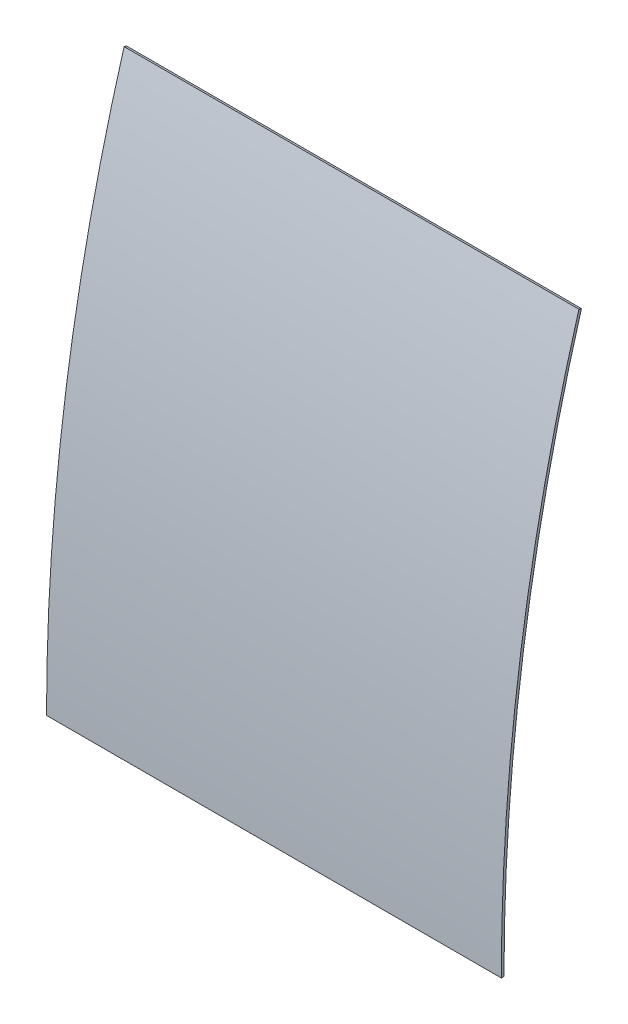
ISO-10303-21;
HEADER;
FILE_DESCRIPTION(('STEP AP214'),'2;1');
FILE_NAME('part.step','',(''),(''),'','','');
FILE_SCHEMA(('AUTOMOTIVE_DESIGN { 1 0 10303 214 1 1 1 1 }'));
ENDSEC;
DATA;
#1=APPLICATION_CONTEXT('core data for automotive mechanical design processes');
#2=APPLICATION_PROTOCOL_DEFINITION('international standard','automotive_design',2000,#1);
#3=PRODUCT_CONTEXT('',#1,'mechanical');
#4=PRODUCT('Part','Part','',(#3));
#5=PRODUCT_RELATED_PRODUCT_CATEGORY('part','',(#4));
#6=PRODUCT_DEFINITION_FORMATION('','',#4);
#7=PRODUCT_DEFINITION_CONTEXT('part definition',#1,'design');
#8=PRODUCT_DEFINITION('design','',#6,#7);
#9=PRODUCT_DEFINITION_SHAPE('','',#8);
#10=(LENGTH_UNIT() NAMED_UNIT(*) SI_UNIT(.MILLI.,.METRE.));
#11=(NAMED_UNIT(*) PLANE_ANGLE_UNIT() SI_UNIT($,.RADIAN.));
#12=(NAMED_UNIT(*) SI_UNIT($,.STERADIAN.) SOLID_ANGLE_UNIT());
#13=UNCERTAINTY_MEASURE_WITH_UNIT(LENGTH_MEASURE(1.E-05),#10,'distance_accuracy_value','');
#14=(GEOMETRIC_REPRESENTATION_CONTEXT(3) GLOBAL_UNCERTAINTY_ASSIGNED_CONTEXT((#13)) GLOBAL_UNIT_ASSIGNED_CONTEXT((#10,
#11,#12)) REPRESENTATION_CONTEXT('',''));
#15=CARTESIAN_POINT('',(0.,0.,0.));
#16=DIRECTION('',(0.,0.,1.));
#17=DIRECTION('',(1.,0.,0.));
#18=AXIS2_PLACEMENT_3D('',#15,#16,#17);
#19=CARTESIAN_POINT('',(269.875,0.,-1139.85237068966));
#20=DIRECTION('',(-1.,0.,0.));
#21=DIRECTION('',(0.,0.,1.));
#22=AXIS2_PLACEMENT_3D('',#19,#20,#21);
#23=CYLINDRICAL_SURFACE('',#22,1138.26487068966);
#24=CARTESIAN_POINT('',(0.,0.,-1139.85237068966));
#25=DIRECTION('',(1.,0.,0.));
#26=DIRECTION('',(0.,0.,-1.));
#27=AXIS2_PLACEMENT_3D('',#24,#25,#26);
#28=CIRCLE('',#27,1138.26487068966);
#29=CARTESIAN_POINT('',(0.,1.11641667431567E-13,-1.58750000000007));
#30=VERTEX_POINT('',#29);
#31=CARTESIAN_POINT('',(0.,320.228388161844,-47.5608824588787));
#32=VERTEX_POINT('',#31);
#33=EDGE_CURVE('E95',#30,#32,#28,.F.);
#34=ORIENTED_EDGE('',*,*,#33,.T.);
#35=DIRECTION('',(-1.,0.,0.));
#36=VECTOR('',#35,1.);
#37=CARTESIAN_POINT('',(269.875,320.228388161844,-47.5608824588787));
#38=LINE('',#37,#36);
#39=CARTESIAN_POINT('',(269.875,320.228388161844,-47.5608824588787));
#40=VERTEX_POINT('',#39);
#41=EDGE_CURVE('E11',#40,#32,#38,.T.);
#42=ORIENTED_EDGE('',*,*,#41,.F.);
#43=CARTESIAN_POINT('',(269.875,0.,-1139.85237068966));
#44=DIRECTION('',(1.,0.,0.));
#45=DIRECTION('',(0.,0.,-1.));
#46=AXIS2_PLACEMENT_3D('',#43,#44,#45);
#47=CIRCLE('',#46,1138.26487068966);
#48=CARTESIAN_POINT('',(269.875,1.11641667431567E-13,-1.58750000000007));
#49=VERTEX_POINT('',#48);
#50=EDGE_CURVE('E72',#49,#40,#47,.F.);
#51=ORIENTED_EDGE('',*,*,#50,.F.);
#52=DIRECTION('',(-1.,0.,0.));
#53=VECTOR('',#52,1.);
#54=CARTESIAN_POINT('',(269.875,1.11641667431567E-13,-1.58750000000007));
#55=LINE('',#54,#53);
#56=EDGE_CURVE('E48',#49,#30,#55,.T.);
#57=ORIENTED_EDGE('',*,*,#56,.T.);
#58=EDGE_LOOP('',(#34,#42,#51,#57));
#59=FACE_BOUND('',#58,.T.);
#60=ADVANCED_FACE('F32',(#59),#23,.F.);
#61=CARTESIAN_POINT('',(269.875,320.675,-46.0375));
#62=DIRECTION('',(0.,0.959610997718853,-0.281330291751576));
#63=DIRECTION('',(0.,0.281330291751576,0.959610997718853));
#64=AXIS2_PLACEMENT_3D('',#61,#62,#63);
#65=PLANE('',#64);
#66=DIRECTION('',(0.,-0.281330291751576,-0.959610997718853));
#67=VECTOR('',#66,1.);
#68=CARTESIAN_POINT('',(0.,320.675,-46.0375));
#69=LINE('',#68,#67);
#70=CARTESIAN_POINT('',(0.,320.675,-46.0375));
#71=VERTEX_POINT('',#70);
#72=EDGE_CURVE('E81',#71,#32,#69,.T.);
#73=ORIENTED_EDGE('',*,*,#72,.F.);
#74=DIRECTION('',(-1.,0.,0.));
#75=VECTOR('',#74,1.);
#76=CARTESIAN_POINT('',(269.875,320.675,-46.0375));
#77=LINE('',#76,#75);
#78=CARTESIAN_POINT('',(269.875,320.675,-46.0375));
#79=VERTEX_POINT('',#78);
#80=EDGE_CURVE('E40',#79,#71,#77,.T.);
#81=ORIENTED_EDGE('',*,*,#80,.F.);
#82=DIRECTION('',(0.,-0.281330291751576,-0.959610997718853));
#83=VECTOR('',#82,1.);
#84=CARTESIAN_POINT('',(269.875,320.675,-46.0375));
#85=LINE('',#84,#83);
#86=EDGE_CURVE('E79',#79,#40,#85,.T.);
#87=ORIENTED_EDGE('',*,*,#86,.T.);
#88=ORIENTED_EDGE('',*,*,#41,.T.);
#89=EDGE_LOOP('',(#73,#81,#87,#88));
#90=FACE_BOUND('',#89,.T.);
#91=ADVANCED_FACE('F78',(#90),#65,.T.);
#92=CARTESIAN_POINT('',(269.875,0.,-1139.85237068966));
#93=DIRECTION('',(-1.,0.,0.));
#94=DIRECTION('',(0.,0.,1.));
#95=AXIS2_PLACEMENT_3D('',#92,#93,#94);
#96=CYLINDRICAL_SURFACE('',#95,1139.85237068966);
#97=CARTESIAN_POINT('',(0.,0.,-1139.85237068966));
#98=DIRECTION('',(-1.,0.,0.));
#99=DIRECTION('',(0.,0.,1.));
#100=AXIS2_PLACEMENT_3D('',#97,#98,#99);
#101=CIRCLE('',#100,1139.85237068966);
#102=CARTESIAN_POINT('',(0.,0.,0.));
#103=VERTEX_POINT('',#102);
#104=EDGE_CURVE('E98',#103,#71,#101,.T.);
#105=ORIENTED_EDGE('',*,*,#104,.F.);
#106=DIRECTION('',(-1.,0.,0.));
#107=VECTOR('',#106,1.);
#108=CARTESIAN_POINT('',(269.875,0.,0.));
#109=LINE('',#108,#107);
#110=CARTESIAN_POINT('',(269.875,0.,0.));
#111=VERTEX_POINT('',#110);
#112=EDGE_CURVE('E61',#111,#103,#109,.T.);
#113=ORIENTED_EDGE('',*,*,#112,.F.);
#114=CARTESIAN_POINT('',(269.875,0.,-1139.85237068966));
#115=DIRECTION('',(-1.,0.,0.));
#116=DIRECTION('',(0.,0.,1.));
#117=AXIS2_PLACEMENT_3D('',#114,#115,#116);
#118=CIRCLE('',#117,1139.85237068966);
#119=EDGE_CURVE('E87',#111,#79,#118,.T.);
#120=ORIENTED_EDGE('',*,*,#119,.T.);
#121=ORIENTED_EDGE('',*,*,#80,.T.);
#122=EDGE_LOOP('',(#105,#113,#120,#121));
#123=FACE_BOUND('',#122,.T.);
#124=ADVANCED_FACE('F89',(#123),#96,.T.);
#125=CARTESIAN_POINT('',(269.875,1.11641667431567E-13,-1.58750000000007));
#126=DIRECTION('',(0.,-1.,0.));
#127=DIRECTION('',(0.,0.,-1.));
#128=AXIS2_PLACEMENT_3D('',#125,#126,#127);
#129=PLANE('',#128);
#130=DIRECTION('',(0.,0.,1.));
#131=VECTOR('',#130,1.);
#132=CARTESIAN_POINT('',(0.,1.11641667431567E-13,-1.58750000000007));
#133=LINE('',#132,#131);
#134=EDGE_CURVE('E100',#30,#103,#133,.T.);
#135=ORIENTED_EDGE('',*,*,#134,.F.);
#136=ORIENTED_EDGE('',*,*,#56,.F.);
#137=DIRECTION('',(0.,0.,1.));
#138=VECTOR('',#137,1.);
#139=CARTESIAN_POINT('',(269.875,1.11641667431567E-13,-1.58750000000007));
#140=LINE('',#139,#138);
#141=EDGE_CURVE('E90',#49,#111,#140,.T.);
#142=ORIENTED_EDGE('',*,*,#141,.T.);
#143=ORIENTED_EDGE('',*,*,#112,.T.);
#144=EDGE_LOOP('',(#135,#136,#142,#143));
#145=FACE_BOUND('',#144,.T.);
#146=ADVANCED_FACE('F106',(#145),#129,.T.);
#147=CARTESIAN_POINT('',(269.875,0.,-1139.85237068966));
#148=DIRECTION('',(1.,0.,0.));
#149=DIRECTION('',(0.,0.,-1.));
#150=AXIS2_PLACEMENT_3D('',#147,#148,#149);
#151=PLANE('',#150);
#152=ORIENTED_EDGE('',*,*,#50,.T.);
#153=ORIENTED_EDGE('',*,*,#86,.F.);
#154=ORIENTED_EDGE('',*,*,#119,.F.);
#155=ORIENTED_EDGE('',*,*,#141,.F.);
#156=EDGE_LOOP('',(#152,#153,#154,#155));
#157=FACE_BOUND('',#156,.T.);
#158=ADVANCED_FACE('F86',(#157),#151,.T.);
#159=CARTESIAN_POINT('',(0.,0.,-1139.85237068966));
#160=DIRECTION('',(1.,0.,0.));
#161=DIRECTION('',(0.,0.,-1.));
#162=AXIS2_PLACEMENT_3D('',#159,#160,#161);
#163=PLANE('',#162);
#164=ORIENTED_EDGE('',*,*,#33,.F.);
#165=ORIENTED_EDGE('',*,*,#134,.T.);
#166=ORIENTED_EDGE('',*,*,#104,.T.);
#167=ORIENTED_EDGE('',*,*,#72,.T.);
#168=EDGE_LOOP('',(#164,#165,#166,#167));
#169=FACE_BOUND('',#168,.T.);
#170=ADVANCED_FACE('F105',(#169),#163,.F.);
#171=CLOSED_SHELL('',(#60,#91,#124,#146,#158,#170));
#172=MANIFOLD_SOLID_BREP('B2',#171);
#173=ADVANCED_BREP_SHAPE_REPRESENTATION('',(#18,#172),#14);
#174=SHAPE_DEFINITION_REPRESENTATION(#9,#173);
ENDSEC;
END-ISO-10303-21;
